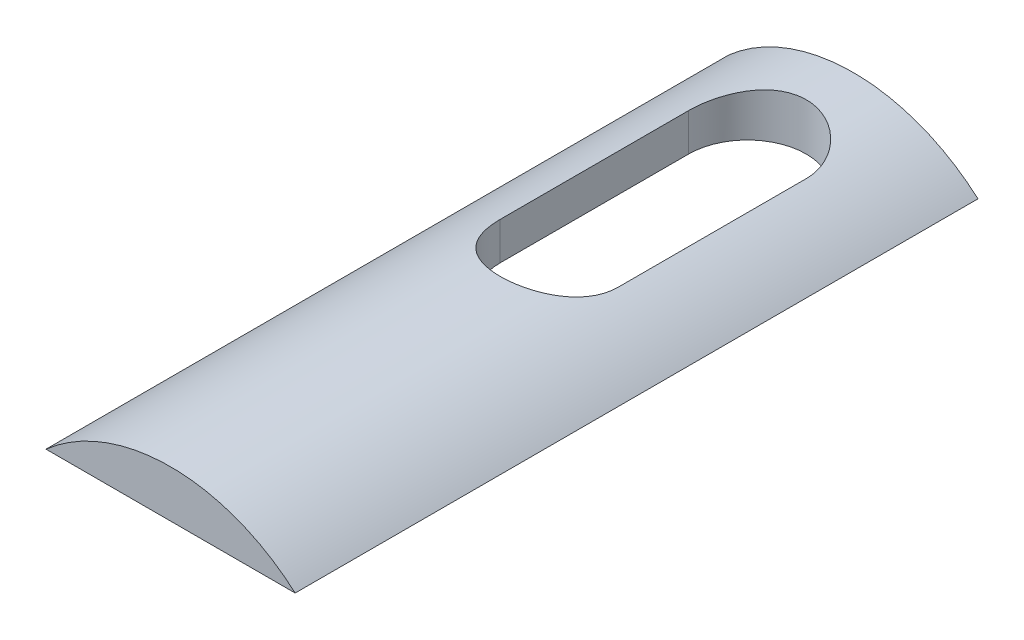
ISO-10303-21;
HEADER;
FILE_DESCRIPTION(('STEP AP214'),'2;1');
FILE_NAME('part.step','',(''),(''),'','','');
FILE_SCHEMA(('AUTOMOTIVE_DESIGN { 1 0 10303 214 1 1 1 1 }'));
ENDSEC;
DATA;
#1=APPLICATION_CONTEXT('core data for automotive mechanical design processes');
#2=APPLICATION_PROTOCOL_DEFINITION('international standard','automotive_design',2000,#1);
#3=PRODUCT_CONTEXT('',#1,'mechanical');
#4=PRODUCT('Part','Part','',(#3));
#5=PRODUCT_RELATED_PRODUCT_CATEGORY('part','',(#4));
#6=PRODUCT_DEFINITION_FORMATION('','',#4);
#7=PRODUCT_DEFINITION_CONTEXT('part definition',#1,'design');
#8=PRODUCT_DEFINITION('design','',#6,#7);
#9=PRODUCT_DEFINITION_SHAPE('','',#8);
#10=(LENGTH_UNIT() NAMED_UNIT(*) SI_UNIT(.MILLI.,.METRE.));
#11=(NAMED_UNIT(*) PLANE_ANGLE_UNIT() SI_UNIT($,.RADIAN.));
#12=(NAMED_UNIT(*) SI_UNIT($,.STERADIAN.) SOLID_ANGLE_UNIT());
#13=UNCERTAINTY_MEASURE_WITH_UNIT(LENGTH_MEASURE(1.E-05),#10,'distance_accuracy_value','');
#14=(GEOMETRIC_REPRESENTATION_CONTEXT(3) GLOBAL_UNCERTAINTY_ASSIGNED_CONTEXT((#13)) GLOBAL_UNIT_ASSIGNED_CONTEXT((#10,
#11,#12)) REPRESENTATION_CONTEXT('',''));
#15=CARTESIAN_POINT('',(0.,0.,0.));
#16=DIRECTION('',(0.,0.,1.));
#17=DIRECTION('',(1.,0.,0.));
#18=AXIS2_PLACEMENT_3D('',#15,#16,#17);
#19=CARTESIAN_POINT('',(0.,-3.,14.5));
#20=DIRECTION('',(0.,0.,-1.));
#21=DIRECTION('',(-1.,0.,0.));
#22=AXIS2_PLACEMENT_3D('',#19,#20,#21);
#23=CYLINDRICAL_SURFACE('',#22,4.);
#24=DIRECTION('',(0.,0.,-1.));
#25=VECTOR('',#24,1.);
#26=CARTESIAN_POINT('',(1.25,0.799671038392665,14.5));
#27=LINE('',#26,#25);
#28=CARTESIAN_POINT('',(1.25,0.799671038392665,2.25));
#29=VERTEX_POINT('',#28);
#30=CARTESIAN_POINT('',(1.25,0.799671038392665,6.25));
#31=VERTEX_POINT('',#30);
#32=EDGE_CURVE('E112',#29,#31,#27,.F.);
#33=ORIENTED_EDGE('',*,*,#32,.T.);
#34=CARTESIAN_POINT('',(1.25,0.799671038392665,6.25));
#35=CARTESIAN_POINT('',(1.25000079209303,0.799667944435724,6.28424267351559));
#36=CARTESIAN_POINT('',(1.24859202414831,0.800134518253132,6.318468016076));
#37=CARTESIAN_POINT('',(1.24297859907589,0.801975441039433,6.38665592023112));
#38=CARTESIAN_POINT('',(1.23877461578363,0.803349571225492,6.4206185431633));
#39=CARTESIAN_POINT('',(1.22204347161027,0.808773416593512,6.52155487481313));
#40=CARTESIAN_POINT('',(1.20539672575393,0.814125034585249,6.58782405091958));
#41=CARTESIAN_POINT('',(1.16170105706965,0.827658009519011,6.71644461065923));
#42=CARTESIAN_POINT('',(1.13465653075566,0.835838170315816,6.77879763721965));
#43=CARTESIAN_POINT('',(1.07098191141403,0.854100649927821,6.89813016962818));
#44=CARTESIAN_POINT('',(1.03434683837194,0.864183956214508,6.95510686277345));
#45=CARTESIAN_POINT('',(0.95119670134728,0.885501087379434,7.06397880258885));
#46=CARTESIAN_POINT('',(0.904410904461598,0.89676086475023,7.11566215512418));
#47=CARTESIAN_POINT('',(0.802863838503522,0.918942107657428,7.21059438554212));
#48=CARTESIAN_POINT('',(0.748101200039561,0.929863514714314,7.2538418122339));
#49=CARTESIAN_POINT('',(0.630624713846965,0.950435741845945,7.3316119152679));
#50=CARTESIAN_POINT('',(0.567759024679221,0.960052231478582,7.36591509948412));
#51=CARTESIAN_POINT('',(0.436801494886547,0.976625799573473,7.42337696670933));
#52=CARTESIAN_POINT('',(0.368711097755109,0.983583609427349,7.44653871513495));
#53=CARTESIAN_POINT('',(0.2314650457398,0.993871706356585,7.48035096238471));
#54=CARTESIAN_POINT('',(0.16240712274646,0.997307320390868,7.49136552756243));
#55=CARTESIAN_POINT('',(0.02334223973806,1.0005359624024,7.50172435756439));
#56=CARTESIAN_POINT('',(-0.0466645207904815,1.00032974453375,7.50107103858517));
#57=CARTESIAN_POINT('',(-0.183074865981444,0.996371150192642,7.48835167402149));
#58=CARTESIAN_POINT('',(-0.249519398059324,0.992741467655172,7.47668048627978));
#59=CARTESIAN_POINT('',(-0.379453793324918,0.98249474986386,7.44290475186552));
#60=CARTESIAN_POINT('',(-0.442943497460834,0.975877554003522,7.42079964427029));
#61=CARTESIAN_POINT('',(-0.566078427751517,0.960234555605752,7.36652968356677));
#62=CARTESIAN_POINT('',(-0.625667029730833,0.951180239840525,7.33424491238092));
#63=CARTESIAN_POINT('',(-0.738703080956739,0.931617119258713,7.26062840173607));
#64=CARTESIAN_POINT('',(-0.792149037013091,0.921107962153692,7.21929446961759));
#65=CARTESIAN_POINT('',(-0.893732933038742,0.899237726884178,7.12673093180925));
#66=CARTESIAN_POINT('',(-0.941557717929872,0.887859395188308,7.07516129613615));
#67=CARTESIAN_POINT('',(-1.02798269424559,0.865908113060729,6.96461484494547));
#68=CARTESIAN_POINT('',(-1.06658010603344,0.855335405965658,6.90563580557438));
#69=CARTESIAN_POINT('',(-1.13382462998813,0.836102643524119,6.78104852840747));
#70=CARTESIAN_POINT('',(-1.16235013646657,0.827466394312381,6.71537084926717));
#71=CARTESIAN_POINT('',(-1.20780456114872,0.813369075643908,6.57984406347614));
#72=CARTESIAN_POINT('',(-1.22475139691405,0.807903102293159,6.51000158465593));
#73=CARTESIAN_POINT('',(-1.24039171566547,0.802821125624096,6.40791244949589));
#74=CARTESIAN_POINT('',(-1.24399403629524,0.801642707887189,6.37642753152909));
#75=CARTESIAN_POINT('',(-1.24879622352388,0.800067410655536,6.31330050332709));
#76=CARTESIAN_POINT('',(-1.2499994827948,0.799669427509527,6.28165867860128));
#77=CARTESIAN_POINT('',(-1.25,0.799671038392666,6.25));
#78=B_SPLINE_CURVE_WITH_KNOTS('',3,(#34,#35,#36,#37,#38,#39,#40,#41,#42,#43,#44,#45,#46,#47,#48,
#49,#50,#51,#52,#53,#54,#55,#56,#57,#58,#59,#60,#61,#62,#63,#64,#65,#66,#67,#68,#69,#70,#71,#72,
#73,#74,#75,#76,#77),.UNSPECIFIED.,.F.,.F.,(4,2,2,2,2,2,2,2,2,2,2,2,2,2,2,2,2,2,2,2,2,4),(0.,
0.10266197993951,0.205299220385667,0.409842514444783,0.614299416009709,0.818862695759799,
1.02975828426833,1.24069012017487,1.45639343375022,1.672037365458,1.88102599922553,
2.08997135593007,2.29170187638529,2.49344324301505,2.69765601223671,2.90191831816448,
3.11467479844758,3.32749528856723,3.54280388777088,3.75777854569082,3.85283052662501,
3.94774799262584),.UNSPECIFIED.);
#79=CARTESIAN_POINT('',(-1.25,0.799671038392665,6.25));
#80=VERTEX_POINT('',#79);
#81=EDGE_CURVE('E92',#31,#80,#78,.T.);
#82=ORIENTED_EDGE('',*,*,#81,.T.);
#83=DIRECTION('',(0.,0.,-1.));
#84=VECTOR('',#83,1.);
#85=CARTESIAN_POINT('',(-1.25,0.799671038392665,14.5));
#86=LINE('',#85,#84);
#87=CARTESIAN_POINT('',(-1.25,0.799671038392665,2.25));
#88=VERTEX_POINT('',#87);
#89=EDGE_CURVE('E122',#80,#88,#86,.T.);
#90=ORIENTED_EDGE('',*,*,#89,.T.);
#91=CARTESIAN_POINT('',(-1.25,0.799671038392665,2.25));
#92=CARTESIAN_POINT('',(-1.25000079209303,0.799667944435724,2.21575732648441));
#93=CARTESIAN_POINT('',(-1.24859202414831,0.800134518253132,2.181531983924));
#94=CARTESIAN_POINT('',(-1.24297859907589,0.801975441039432,2.11334407976888));
#95=CARTESIAN_POINT('',(-1.23877461578363,0.803349571225492,2.0793814568367));
#96=CARTESIAN_POINT('',(-1.22204347161027,0.808773416593512,1.97844512518687));
#97=CARTESIAN_POINT('',(-1.20539672575393,0.81412503458525,1.91217594908042));
#98=CARTESIAN_POINT('',(-1.16170105706965,0.827658009519011,1.78355538934077));
#99=CARTESIAN_POINT('',(-1.13465653075566,0.835838170315816,1.72120236278035));
#100=CARTESIAN_POINT('',(-1.07098191141403,0.85410064992782,1.60186983037183));
#101=CARTESIAN_POINT('',(-1.03434683837194,0.864183956214508,1.54489313722655));
#102=CARTESIAN_POINT('',(-0.951196701347281,0.885501087379435,1.43602119741116));
#103=CARTESIAN_POINT('',(-0.904410904461598,0.89676086475023,1.38433784487583));
#104=CARTESIAN_POINT('',(-0.802863838503523,0.918942107657427,1.28940561445788));
#105=CARTESIAN_POINT('',(-0.748101200039563,0.929863514714314,1.2461581877661));
#106=CARTESIAN_POINT('',(-0.630624713846966,0.950435741845945,1.1683880847321));
#107=CARTESIAN_POINT('',(-0.567759024679223,0.960052231478582,1.13408490051588));
#108=CARTESIAN_POINT('',(-0.436801494886548,0.976625799573473,1.07662303329067));
#109=CARTESIAN_POINT('',(-0.36871109775511,0.98358360942735,1.05346128486506));
#110=CARTESIAN_POINT('',(-0.231465045739801,0.993871706356585,1.01964903761529));
#111=CARTESIAN_POINT('',(-0.162407122746461,0.997307320390868,1.00863447243757));
#112=CARTESIAN_POINT('',(-0.0233422397380612,1.0005359624024,0.998275642435612));
#113=CARTESIAN_POINT('',(0.0466645207904802,1.00032974453375,0.998928961414832));
#114=CARTESIAN_POINT('',(0.183074865981442,0.996371150192642,1.01164832597851));
#115=CARTESIAN_POINT('',(0.249519398059323,0.992741467655172,1.02331951372022));
#116=CARTESIAN_POINT('',(0.379453793324916,0.98249474986386,1.05709524813448));
#117=CARTESIAN_POINT('',(0.442943497460833,0.975877554003522,1.07920035572971));
#118=CARTESIAN_POINT('',(0.566078427751516,0.960234555605752,1.13347031643323));
#119=CARTESIAN_POINT('',(0.625667029730832,0.951180239840525,1.16575508761908));
#120=CARTESIAN_POINT('',(0.738703080956738,0.931617119258713,1.23937159826393));
#121=CARTESIAN_POINT('',(0.79214903701309,0.921107962153693,1.28070553038241));
#122=CARTESIAN_POINT('',(0.893732933038741,0.899237726884179,1.37326906819075));
#123=CARTESIAN_POINT('',(0.941557717929871,0.887859395188308,1.42483870386385));
#124=CARTESIAN_POINT('',(1.02798269424559,0.865908113060729,1.53538515505453));
#125=CARTESIAN_POINT('',(1.06658010603344,0.855335405965658,1.59436419442562));
#126=CARTESIAN_POINT('',(1.13382462998813,0.836102643524119,1.71895147159253));
#127=CARTESIAN_POINT('',(1.16235013646657,0.827466394312381,1.78462915073283));
#128=CARTESIAN_POINT('',(1.20780456114872,0.813369075643908,1.92015593652386));
#129=CARTESIAN_POINT('',(1.22475139691405,0.807903102293159,1.98999841534407));
#130=CARTESIAN_POINT('',(1.24039171566547,0.802821125624096,2.09208755050411));
#131=CARTESIAN_POINT('',(1.24399403629524,0.80164270788719,2.12357246847091));
#132=CARTESIAN_POINT('',(1.24879622352388,0.800067410655537,2.18669949667291));
#133=CARTESIAN_POINT('',(1.2499994827948,0.799669427509527,2.21834132139872));
#134=CARTESIAN_POINT('',(1.25,0.799671038392666,2.25));
#135=B_SPLINE_CURVE_WITH_KNOTS('',3,(#91,#92,#93,#94,#95,#96,#97,#98,#99,#100,#101,#102,#103,
#104,#105,#106,#107,#108,#109,#110,#111,#112,#113,#114,#115,#116,#117,#118,#119,#120,#121,#122,
#123,#124,#125,#126,#127,#128,#129,#130,#131,#132,#133,#134),.UNSPECIFIED.,.F.,.F.,(4,2,2,2,2,2,
2,2,2,2,2,2,2,2,2,2,2,2,2,2,2,4),(0.,0.10266197993951,0.205299220385667,0.409842514444783,
0.614299416009708,0.818862695759799,1.02975828426833,1.24069012017487,1.45639343375022,
1.672037365458,1.88102599922553,2.08997135593007,2.29170187638529,2.49344324301505,
2.69765601223671,2.90191831816448,3.11467479844758,3.32749528856723,3.54280388777088,
3.75777854569082,3.85283052662501,3.94774799262584),.UNSPECIFIED.);
#136=EDGE_CURVE('E138',#88,#29,#135,.T.);
#137=ORIENTED_EDGE('',*,*,#136,.T.);
#138=EDGE_LOOP('',(#33,#82,#90,#137));
#139=FACE_BOUND('',#138,.T.);
#140=CARTESIAN_POINT('',(0.,-3.,0.));
#141=DIRECTION('',(0.,0.,1.));
#142=DIRECTION('',(1.,0.,0.));
#143=AXIS2_PLACEMENT_3D('',#140,#141,#142);
#144=CIRCLE('',#143,4.);
#145=CARTESIAN_POINT('',(2.64575131106459,0.,0.));
#146=VERTEX_POINT('',#145);
#147=CARTESIAN_POINT('',(-2.64575131106459,0.,0.));
#148=VERTEX_POINT('',#147);
#149=EDGE_CURVE('E144',#146,#148,#144,.T.);
#150=ORIENTED_EDGE('',*,*,#149,.T.);
#151=DIRECTION('',(0.,0.,-1.));
#152=VECTOR('',#151,1.);
#153=CARTESIAN_POINT('',(-2.64575131106459,0.,14.5));
#154=LINE('',#153,#152);
#155=CARTESIAN_POINT('',(-2.64575131106459,0.,14.5));
#156=VERTEX_POINT('',#155);
#157=EDGE_CURVE('E11',#156,#148,#154,.T.);
#158=ORIENTED_EDGE('',*,*,#157,.F.);
#159=CARTESIAN_POINT('',(0.,-3.,14.5));
#160=DIRECTION('',(0.,0.,1.));
#161=DIRECTION('',(1.,0.,0.));
#162=AXIS2_PLACEMENT_3D('',#159,#160,#161);
#163=CIRCLE('',#162,4.);
#164=CARTESIAN_POINT('',(2.64575131106459,0.,14.5));
#165=VERTEX_POINT('',#164);
#166=EDGE_CURVE('E145',#165,#156,#163,.T.);
#167=ORIENTED_EDGE('',*,*,#166,.F.);
#168=DIRECTION('',(0.,0.,-1.));
#169=VECTOR('',#168,1.);
#170=CARTESIAN_POINT('',(2.64575131106459,0.,14.5));
#171=LINE('',#170,#169);
#172=EDGE_CURVE('E41',#165,#146,#171,.T.);
#173=ORIENTED_EDGE('',*,*,#172,.T.);
#174=EDGE_LOOP('',(#150,#158,#167,#173));
#175=FACE_BOUND('',#174,.T.);
#176=ADVANCED_FACE('F33',(#139,#175),#23,.T.);
#177=CARTESIAN_POINT('',(-2.64575131106459,0.,14.5));
#178=DIRECTION('',(0.,1.,0.));
#179=DIRECTION('',(0.,0.,1.));
#180=AXIS2_PLACEMENT_3D('',#177,#178,#179);
#181=PLANE('',#180);
#182=DIRECTION('',(0.,0.,1.));
#183=VECTOR('',#182,1.);
#184=CARTESIAN_POINT('',(1.25,0.,2.25));
#185=LINE('',#184,#183);
#186=CARTESIAN_POINT('',(1.25,0.,2.25));
#187=VERTEX_POINT('',#186);
#188=CARTESIAN_POINT('',(1.25,0.,6.25));
#189=VERTEX_POINT('',#188);
#190=EDGE_CURVE('E98',#187,#189,#185,.T.);
#191=ORIENTED_EDGE('',*,*,#190,.F.);
#192=CARTESIAN_POINT('',(0.,0.,2.25));
#193=DIRECTION('',(0.,-1.,0.));
#194=DIRECTION('',(0.,0.,-1.));
#195=AXIS2_PLACEMENT_3D('',#192,#193,#194);
#196=CIRCLE('',#195,1.25);
#197=CARTESIAN_POINT('',(-1.25,0.,2.25));
#198=VERTEX_POINT('',#197);
#199=EDGE_CURVE('E56',#198,#187,#196,.T.);
#200=ORIENTED_EDGE('',*,*,#199,.F.);
#201=DIRECTION('',(0.,0.,-1.));
#202=VECTOR('',#201,1.);
#203=CARTESIAN_POINT('',(-1.25,0.,2.25));
#204=LINE('',#203,#202);
#205=CARTESIAN_POINT('',(-1.25,0.,6.25));
#206=VERTEX_POINT('',#205);
#207=EDGE_CURVE('E105',#206,#198,#204,.T.);
#208=ORIENTED_EDGE('',*,*,#207,.F.);
#209=CARTESIAN_POINT('',(0.,0.,6.25));
#210=DIRECTION('',(0.,-1.,0.));
#211=DIRECTION('',(0.,0.,-1.));
#212=AXIS2_PLACEMENT_3D('',#209,#210,#211);
#213=CIRCLE('',#212,1.25);
#214=EDGE_CURVE('E90',#189,#206,#213,.T.);
#215=ORIENTED_EDGE('',*,*,#214,.F.);
#216=EDGE_LOOP('',(#191,#200,#208,#215));
#217=FACE_BOUND('',#216,.T.);
#218=DIRECTION('',(1.,0.,0.));
#219=VECTOR('',#218,1.);
#220=CARTESIAN_POINT('',(-2.64575131106459,0.,0.));
#221=LINE('',#220,#219);
#222=EDGE_CURVE('E149',#148,#146,#221,.T.);
#223=ORIENTED_EDGE('',*,*,#222,.T.);
#224=ORIENTED_EDGE('',*,*,#172,.F.);
#225=DIRECTION('',(1.,0.,0.));
#226=VECTOR('',#225,1.);
#227=CARTESIAN_POINT('',(-2.64575131106459,0.,14.5));
#228=LINE('',#227,#226);
#229=EDGE_CURVE('E148',#156,#165,#228,.T.);
#230=ORIENTED_EDGE('',*,*,#229,.F.);
#231=ORIENTED_EDGE('',*,*,#157,.T.);
#232=EDGE_LOOP('',(#223,#224,#230,#231));
#233=FACE_BOUND('',#232,.T.);
#234=ADVANCED_FACE('F102',(#217,#233),#181,.F.);
#235=CARTESIAN_POINT('',(0.,-3.,14.5));
#236=DIRECTION('',(0.,0.,1.));
#237=DIRECTION('',(1.,0.,0.));
#238=AXIS2_PLACEMENT_3D('',#235,#236,#237);
#239=PLANE('',#238);
#240=ORIENTED_EDGE('',*,*,#166,.T.);
#241=ORIENTED_EDGE('',*,*,#229,.T.);
#242=EDGE_LOOP('',(#240,#241));
#243=FACE_BOUND('',#242,.T.);
#244=ADVANCED_FACE('F136',(#243),#239,.T.);
#245=CARTESIAN_POINT('',(0.,-3.,0.));
#246=DIRECTION('',(0.,0.,1.));
#247=DIRECTION('',(1.,0.,0.));
#248=AXIS2_PLACEMENT_3D('',#245,#246,#247);
#249=PLANE('',#248);
#250=ORIENTED_EDGE('',*,*,#149,.F.);
#251=ORIENTED_EDGE('',*,*,#222,.F.);
#252=EDGE_LOOP('',(#250,#251));
#253=FACE_BOUND('',#252,.T.);
#254=ADVANCED_FACE('F135',(#253),#249,.F.);
#255=CARTESIAN_POINT('',(0.,1.,2.25));
#256=DIRECTION('',(0.,-1.,0.));
#257=DIRECTION('',(0.,0.,-1.));
#258=AXIS2_PLACEMENT_3D('',#255,#256,#257);
#259=CYLINDRICAL_SURFACE('',#258,1.25);
#260=DIRECTION('',(0.,-1.,0.));
#261=VECTOR('',#260,1.);
#262=CARTESIAN_POINT('',(-1.25,1.,2.25));
#263=LINE('',#262,#261);
#264=EDGE_CURVE('E110',#88,#198,#263,.T.);
#265=ORIENTED_EDGE('',*,*,#264,.T.);
#266=ORIENTED_EDGE('',*,*,#199,.T.);
#267=DIRECTION('',(0.,-1.,0.));
#268=VECTOR('',#267,1.);
#269=CARTESIAN_POINT('',(1.25,1.,2.25));
#270=LINE('',#269,#268);
#271=EDGE_CURVE('E95',#29,#187,#270,.T.);
#272=ORIENTED_EDGE('',*,*,#271,.F.);
#273=ORIENTED_EDGE('',*,*,#136,.F.);
#274=EDGE_LOOP('',(#265,#266,#272,#273));
#275=FACE_BOUND('',#274,.T.);
#276=ADVANCED_FACE('F131',(#275),#259,.F.);
#277=CARTESIAN_POINT('',(-1.25,1.,2.25));
#278=DIRECTION('',(-1.,0.,0.));
#279=DIRECTION('',(0.,0.,1.));
#280=AXIS2_PLACEMENT_3D('',#277,#278,#279);
#281=PLANE('',#280);
#282=DIRECTION('',(0.,-1.,0.));
#283=VECTOR('',#282,1.);
#284=CARTESIAN_POINT('',(-1.25,1.,6.25));
#285=LINE('',#284,#283);
#286=EDGE_CURVE('E94',#80,#206,#285,.T.);
#287=ORIENTED_EDGE('',*,*,#286,.T.);
#288=ORIENTED_EDGE('',*,*,#207,.T.);
#289=ORIENTED_EDGE('',*,*,#264,.F.);
#290=ORIENTED_EDGE('',*,*,#89,.F.);
#291=EDGE_LOOP('',(#287,#288,#289,#290));
#292=FACE_BOUND('',#291,.T.);
#293=ADVANCED_FACE('F128',(#292),#281,.F.);
#294=CARTESIAN_POINT('',(0.,1.,6.25));
#295=DIRECTION('',(0.,-1.,0.));
#296=DIRECTION('',(0.,0.,-1.));
#297=AXIS2_PLACEMENT_3D('',#294,#295,#296);
#298=CYLINDRICAL_SURFACE('',#297,1.25);
#299=DIRECTION('',(0.,-1.,0.));
#300=VECTOR('',#299,1.);
#301=CARTESIAN_POINT('',(1.25,1.,6.25));
#302=LINE('',#301,#300);
#303=EDGE_CURVE('E48',#31,#189,#302,.T.);
#304=ORIENTED_EDGE('',*,*,#303,.T.);
#305=ORIENTED_EDGE('',*,*,#214,.T.);
#306=ORIENTED_EDGE('',*,*,#286,.F.);
#307=ORIENTED_EDGE('',*,*,#81,.F.);
#308=EDGE_LOOP('',(#304,#305,#306,#307));
#309=FACE_BOUND('',#308,.T.);
#310=ADVANCED_FACE('F87',(#309),#298,.F.);
#311=CARTESIAN_POINT('',(1.25,1.,2.25));
#312=DIRECTION('',(1.,0.,0.));
#313=DIRECTION('',(0.,0.,-1.));
#314=AXIS2_PLACEMENT_3D('',#311,#312,#313);
#315=PLANE('',#314);
#316=ORIENTED_EDGE('',*,*,#271,.T.);
#317=ORIENTED_EDGE('',*,*,#190,.T.);
#318=ORIENTED_EDGE('',*,*,#303,.F.);
#319=ORIENTED_EDGE('',*,*,#32,.F.);
#320=EDGE_LOOP('',(#316,#317,#318,#319));
#321=FACE_BOUND('',#320,.T.);
#322=ADVANCED_FACE('F99',(#321),#315,.F.);
#323=CLOSED_SHELL('',(#176,#234,#244,#254,#276,#293,#310,#322));
#324=MANIFOLD_SOLID_BREP('B2',#323);
#325=ADVANCED_BREP_SHAPE_REPRESENTATION('',(#18,#324),#14);
#326=SHAPE_DEFINITION_REPRESENTATION(#9,#325);
ENDSEC;
END-ISO-10303-21;
